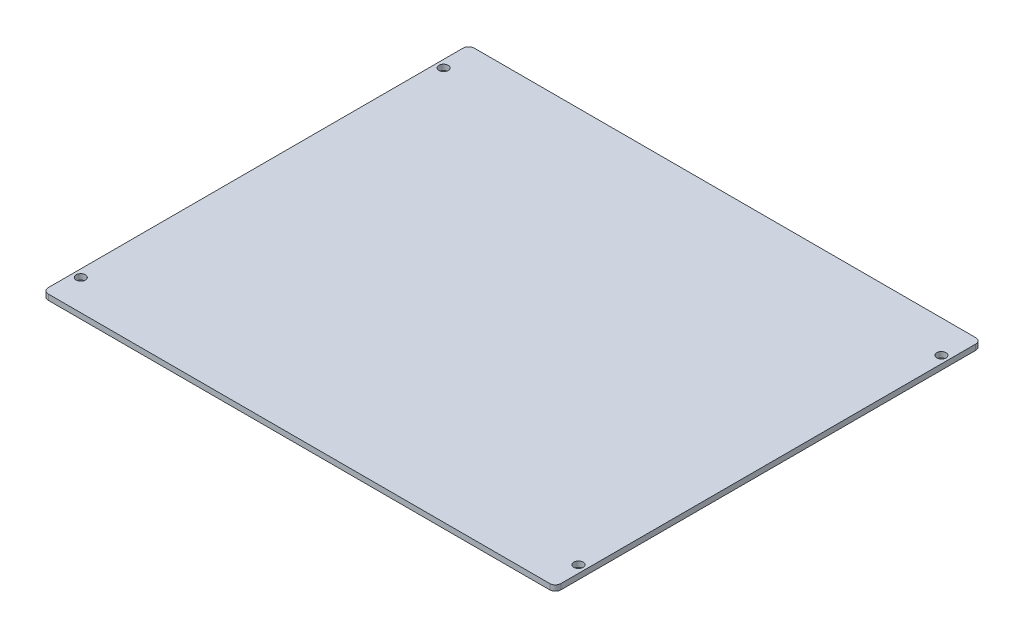
ISO-10303-21;
HEADER;
FILE_DESCRIPTION(('STEP AP214'),'2;1');
FILE_NAME('part.step','',(''),(''),'','','');
FILE_SCHEMA(('AUTOMOTIVE_DESIGN { 1 0 10303 214 1 1 1 1 }'));
ENDSEC;
DATA;
#1=APPLICATION_CONTEXT('core data for automotive mechanical design processes');
#2=APPLICATION_PROTOCOL_DEFINITION('international standard','automotive_design',2000,#1);
#3=PRODUCT_CONTEXT('',#1,'mechanical');
#4=PRODUCT('Part','Part','',(#3));
#5=PRODUCT_RELATED_PRODUCT_CATEGORY('part','',(#4));
#6=PRODUCT_DEFINITION_FORMATION('','',#4);
#7=PRODUCT_DEFINITION_CONTEXT('part definition',#1,'design');
#8=PRODUCT_DEFINITION('design','',#6,#7);
#9=PRODUCT_DEFINITION_SHAPE('','',#8);
#10=(LENGTH_UNIT() NAMED_UNIT(*) SI_UNIT(.MILLI.,.METRE.));
#11=(NAMED_UNIT(*) PLANE_ANGLE_UNIT() SI_UNIT($,.RADIAN.));
#12=(NAMED_UNIT(*) SI_UNIT($,.STERADIAN.) SOLID_ANGLE_UNIT());
#13=UNCERTAINTY_MEASURE_WITH_UNIT(LENGTH_MEASURE(1.E-05),#10,'distance_accuracy_value','');
#14=(GEOMETRIC_REPRESENTATION_CONTEXT(3) GLOBAL_UNCERTAINTY_ASSIGNED_CONTEXT((#13)) GLOBAL_UNIT_ASSIGNED_CONTEXT((#10,
#11,#12)) REPRESENTATION_CONTEXT('',''));
#15=CARTESIAN_POINT('',(0.,0.,0.));
#16=DIRECTION('',(0.,0.,1.));
#17=DIRECTION('',(1.,0.,0.));
#18=AXIS2_PLACEMENT_3D('',#15,#16,#17);
#19=CARTESIAN_POINT('',(3.,3.,-3.));
#20=DIRECTION('',(0.,-1.,0.));
#21=DIRECTION('',(0.,0.,-1.));
#22=AXIS2_PLACEMENT_3D('',#19,#20,#21);
#23=PLANE('',#22);
#24=CARTESIAN_POINT('',(3.,3.,-3.));
#25=DIRECTION('',(0.,1.,0.));
#26=DIRECTION('',(0.,0.,-1.));
#27=AXIS2_PLACEMENT_3D('',#24,#25,#26);
#28=CIRCLE('',#27,3.);
#29=CARTESIAN_POINT('',(0.,3.,-3.));
#30=VERTEX_POINT('',#29);
#31=CARTESIAN_POINT('',(3.,3.,0.));
#32=VERTEX_POINT('',#31);
#33=EDGE_CURVE('E170',#30,#32,#28,.T.);
#34=ORIENTED_EDGE('',*,*,#33,.T.);
#35=DIRECTION('',(1.,0.,0.));
#36=VECTOR('',#35,1.);
#37=CARTESIAN_POINT('',(3.,3.,0.));
#38=LINE('',#37,#36);
#39=CARTESIAN_POINT('',(275.,3.,0.));
#40=VERTEX_POINT('',#39);
#41=EDGE_CURVE('E106',#32,#40,#38,.T.);
#42=ORIENTED_EDGE('',*,*,#41,.T.);
#43=CARTESIAN_POINT('',(275.,3.,-3.));
#44=DIRECTION('',(0.,1.,0.));
#45=DIRECTION('',(0.,0.,1.));
#46=AXIS2_PLACEMENT_3D('',#43,#44,#45);
#47=CIRCLE('',#46,3.);
#48=CARTESIAN_POINT('',(278.,3.,-3.));
#49=VERTEX_POINT('',#48);
#50=EDGE_CURVE('E191',#40,#49,#47,.T.);
#51=ORIENTED_EDGE('',*,*,#50,.T.);
#52=DIRECTION('',(0.,0.,-1.));
#53=VECTOR('',#52,1.);
#54=CARTESIAN_POINT('',(278.,3.,-3.));
#55=LINE('',#54,#53);
#56=CARTESIAN_POINT('',(278.,3.,-228.));
#57=VERTEX_POINT('',#56);
#58=EDGE_CURVE('E205',#49,#57,#55,.T.);
#59=ORIENTED_EDGE('',*,*,#58,.T.);
#60=CARTESIAN_POINT('',(275.,3.,-228.));
#61=DIRECTION('',(0.,1.,0.));
#62=DIRECTION('',(0.,0.,-1.));
#63=AXIS2_PLACEMENT_3D('',#60,#61,#62);
#64=CIRCLE('',#63,3.);
#65=CARTESIAN_POINT('',(275.,3.,-231.));
#66=VERTEX_POINT('',#65);
#67=EDGE_CURVE('E125',#57,#66,#64,.T.);
#68=ORIENTED_EDGE('',*,*,#67,.T.);
#69=DIRECTION('',(-1.,0.,0.));
#70=VECTOR('',#69,1.);
#71=CARTESIAN_POINT('',(3.,3.,-231.));
#72=LINE('',#71,#70);
#73=CARTESIAN_POINT('',(3.,3.,-231.));
#74=VERTEX_POINT('',#73);
#75=EDGE_CURVE('E119',#66,#74,#72,.T.);
#76=ORIENTED_EDGE('',*,*,#75,.T.);
#77=CARTESIAN_POINT('',(3.,3.,-228.));
#78=DIRECTION('',(0.,1.,0.));
#79=DIRECTION('',(0.,0.,-1.));
#80=AXIS2_PLACEMENT_3D('',#77,#78,#79);
#81=CIRCLE('',#80,3.);
#82=CARTESIAN_POINT('',(0.,3.,-228.));
#83=VERTEX_POINT('',#82);
#84=EDGE_CURVE('E123',#74,#83,#81,.T.);
#85=ORIENTED_EDGE('',*,*,#84,.T.);
#86=DIRECTION('',(0.,0.,1.));
#87=VECTOR('',#86,1.);
#88=CARTESIAN_POINT('',(0.,3.,-3.));
#89=LINE('',#88,#87);
#90=EDGE_CURVE('E63',#83,#30,#89,.T.);
#91=ORIENTED_EDGE('',*,*,#90,.T.);
#92=EDGE_LOOP('',(#34,#42,#51,#59,#68,#76,#85,#91));
#93=FACE_BOUND('',#92,.T.);
#94=CARTESIAN_POINT('',(4.03226132280665,3.,-213.395));
#95=DIRECTION('',(0.,1.,0.));
#96=DIRECTION('',(0.,0.,1.));
#97=AXIS2_PLACEMENT_3D('',#94,#95,#96);
#98=CIRCLE('',#97,2.5);
#99=CARTESIAN_POINT('',(4.03226132280665,3.,-210.895));
#100=VERTEX_POINT('',#99);
#101=EDGE_CURVE('E152',#100,#100,#98,.T.);
#102=ORIENTED_EDGE('',*,*,#101,.F.);
#103=EDGE_LOOP('',(#102));
#104=FACE_BOUND('',#103,.T.);
#105=CARTESIAN_POINT('',(4.03226132280665,3.,-16.605));
#106=DIRECTION('',(0.,1.,0.));
#107=DIRECTION('',(0.,0.,-1.));
#108=AXIS2_PLACEMENT_3D('',#105,#106,#107);
#109=CIRCLE('',#108,2.5);
#110=CARTESIAN_POINT('',(4.03226132280665,3.,-19.105));
#111=VERTEX_POINT('',#110);
#112=EDGE_CURVE('E219',#111,#111,#109,.T.);
#113=ORIENTED_EDGE('',*,*,#112,.F.);
#114=EDGE_LOOP('',(#113));
#115=FACE_BOUND('',#114,.T.);
#116=CARTESIAN_POINT('',(273.967738677193,3.,-16.605));
#117=DIRECTION('',(0.,1.,0.));
#118=DIRECTION('',(0.,0.,1.));
#119=AXIS2_PLACEMENT_3D('',#116,#117,#118);
#120=CIRCLE('',#119,2.50000000000002);
#121=CARTESIAN_POINT('',(273.967738677193,3.,-14.105));
#122=VERTEX_POINT('',#121);
#123=EDGE_CURVE('E227',#122,#122,#120,.T.);
#124=ORIENTED_EDGE('',*,*,#123,.F.);
#125=EDGE_LOOP('',(#124));
#126=FACE_BOUND('',#125,.T.);
#127=CARTESIAN_POINT('',(273.967738677193,3.,-213.395));
#128=DIRECTION('',(0.,1.,0.));
#129=DIRECTION('',(0.,0.,-1.));
#130=AXIS2_PLACEMENT_3D('',#127,#128,#129);
#131=CIRCLE('',#130,2.50000000000002);
#132=CARTESIAN_POINT('',(273.967738677193,3.,-215.895));
#133=VERTEX_POINT('',#132);
#134=EDGE_CURVE('E235',#133,#133,#131,.T.);
#135=ORIENTED_EDGE('',*,*,#134,.F.);
#136=EDGE_LOOP('',(#135));
#137=FACE_BOUND('',#136,.T.);
#138=ADVANCED_FACE('F45',(#93,#104,#115,#126,#137),#23,.F.);
#139=CARTESIAN_POINT('',(3.,0.,-3.));
#140=DIRECTION('',(0.,-1.,0.));
#141=DIRECTION('',(0.,0.,-1.));
#142=AXIS2_PLACEMENT_3D('',#139,#140,#141);
#143=PLANE('',#142);
#144=CARTESIAN_POINT('',(273.967738677193,0.,-16.605));
#145=DIRECTION('',(0.,1.,0.));
#146=DIRECTION('',(0.,0.,1.));
#147=AXIS2_PLACEMENT_3D('',#144,#145,#146);
#148=CIRCLE('',#147,2.50000000000002);
#149=CARTESIAN_POINT('',(273.967738677193,0.,-14.105));
#150=VERTEX_POINT('',#149);
#151=EDGE_CURVE('E231',#150,#150,#148,.T.);
#152=ORIENTED_EDGE('',*,*,#151,.T.);
#153=EDGE_LOOP('',(#152));
#154=FACE_BOUND('',#153,.T.);
#155=CARTESIAN_POINT('',(4.03226132280665,0.,-213.395));
#156=DIRECTION('',(0.,1.,0.));
#157=DIRECTION('',(0.,0.,1.));
#158=AXIS2_PLACEMENT_3D('',#155,#156,#157);
#159=CIRCLE('',#158,2.5);
#160=CARTESIAN_POINT('',(4.03226132280665,0.,-210.895));
#161=VERTEX_POINT('',#160);
#162=EDGE_CURVE('E215',#161,#161,#159,.T.);
#163=ORIENTED_EDGE('',*,*,#162,.T.);
#164=EDGE_LOOP('',(#163));
#165=FACE_BOUND('',#164,.T.);
#166=CARTESIAN_POINT('',(3.,0.,-3.));
#167=DIRECTION('',(0.,1.,0.));
#168=DIRECTION('',(0.,0.,-1.));
#169=AXIS2_PLACEMENT_3D('',#166,#167,#168);
#170=CIRCLE('',#169,3.);
#171=CARTESIAN_POINT('',(0.,0.,-3.));
#172=VERTEX_POINT('',#171);
#173=CARTESIAN_POINT('',(3.,0.,0.));
#174=VERTEX_POINT('',#173);
#175=EDGE_CURVE('E147',#172,#174,#170,.T.);
#176=ORIENTED_EDGE('',*,*,#175,.F.);
#177=DIRECTION('',(0.,0.,1.));
#178=VECTOR('',#177,1.);
#179=CARTESIAN_POINT('',(0.,0.,-3.));
#180=LINE('',#179,#178);
#181=CARTESIAN_POINT('',(0.,0.,-228.));
#182=VERTEX_POINT('',#181);
#183=EDGE_CURVE('E98',#182,#172,#180,.T.);
#184=ORIENTED_EDGE('',*,*,#183,.F.);
#185=CARTESIAN_POINT('',(3.,0.,-228.));
#186=DIRECTION('',(0.,1.,0.));
#187=DIRECTION('',(0.,0.,-1.));
#188=AXIS2_PLACEMENT_3D('',#185,#186,#187);
#189=CIRCLE('',#188,3.);
#190=CARTESIAN_POINT('',(3.,0.,-231.));
#191=VERTEX_POINT('',#190);
#192=EDGE_CURVE('E92',#191,#182,#189,.T.);
#193=ORIENTED_EDGE('',*,*,#192,.F.);
#194=DIRECTION('',(-1.,0.,0.));
#195=VECTOR('',#194,1.);
#196=CARTESIAN_POINT('',(3.,0.,-231.));
#197=LINE('',#196,#195);
#198=CARTESIAN_POINT('',(275.,0.,-231.));
#199=VERTEX_POINT('',#198);
#200=EDGE_CURVE('E134',#199,#191,#197,.T.);
#201=ORIENTED_EDGE('',*,*,#200,.F.);
#202=CARTESIAN_POINT('',(275.,0.,-228.));
#203=DIRECTION('',(0.,1.,0.));
#204=DIRECTION('',(0.,0.,-1.));
#205=AXIS2_PLACEMENT_3D('',#202,#203,#204);
#206=CIRCLE('',#205,3.);
#207=CARTESIAN_POINT('',(278.,0.,-228.));
#208=VERTEX_POINT('',#207);
#209=EDGE_CURVE('E161',#208,#199,#206,.T.);
#210=ORIENTED_EDGE('',*,*,#209,.F.);
#211=DIRECTION('',(0.,0.,-1.));
#212=VECTOR('',#211,1.);
#213=CARTESIAN_POINT('',(278.,0.,-3.));
#214=LINE('',#213,#212);
#215=CARTESIAN_POINT('',(278.,0.,-3.));
#216=VERTEX_POINT('',#215);
#217=EDGE_CURVE('E158',#216,#208,#214,.T.);
#218=ORIENTED_EDGE('',*,*,#217,.F.);
#219=CARTESIAN_POINT('',(275.,0.,-3.));
#220=DIRECTION('',(0.,1.,0.));
#221=DIRECTION('',(0.,0.,1.));
#222=AXIS2_PLACEMENT_3D('',#219,#220,#221);
#223=CIRCLE('',#222,3.);
#224=CARTESIAN_POINT('',(275.,0.,0.));
#225=VERTEX_POINT('',#224);
#226=EDGE_CURVE('E155',#225,#216,#223,.T.);
#227=ORIENTED_EDGE('',*,*,#226,.F.);
#228=DIRECTION('',(1.,0.,0.));
#229=VECTOR('',#228,1.);
#230=CARTESIAN_POINT('',(3.,0.,0.));
#231=LINE('',#230,#229);
#232=EDGE_CURVE('E151',#174,#225,#231,.T.);
#233=ORIENTED_EDGE('',*,*,#232,.F.);
#234=EDGE_LOOP('',(#176,#184,#193,#201,#210,#218,#227,#233));
#235=FACE_BOUND('',#234,.T.);
#236=CARTESIAN_POINT('',(4.03226132280665,0.,-16.605));
#237=DIRECTION('',(0.,1.,0.));
#238=DIRECTION('',(0.,0.,-1.));
#239=AXIS2_PLACEMENT_3D('',#236,#237,#238);
#240=CIRCLE('',#239,2.5);
#241=CARTESIAN_POINT('',(4.03226132280665,0.,-19.105));
#242=VERTEX_POINT('',#241);
#243=EDGE_CURVE('E223',#242,#242,#240,.T.);
#244=ORIENTED_EDGE('',*,*,#243,.T.);
#245=EDGE_LOOP('',(#244));
#246=FACE_BOUND('',#245,.T.);
#247=CARTESIAN_POINT('',(273.967738677193,0.,-213.395));
#248=DIRECTION('',(0.,1.,0.));
#249=DIRECTION('',(0.,0.,-1.));
#250=AXIS2_PLACEMENT_3D('',#247,#248,#249);
#251=CIRCLE('',#250,2.50000000000002);
#252=CARTESIAN_POINT('',(273.967738677193,0.,-215.895));
#253=VERTEX_POINT('',#252);
#254=EDGE_CURVE('E239',#253,#253,#251,.T.);
#255=ORIENTED_EDGE('',*,*,#254,.T.);
#256=EDGE_LOOP('',(#255));
#257=FACE_BOUND('',#256,.T.);
#258=ADVANCED_FACE('F195',(#154,#165,#235,#246,#257),#143,.T.);
#259=CARTESIAN_POINT('',(3.,3.,-3.));
#260=DIRECTION('',(0.,-1.,0.));
#261=DIRECTION('',(0.,0.,-1.));
#262=AXIS2_PLACEMENT_3D('',#259,#260,#261);
#263=CYLINDRICAL_SURFACE('',#262,3.);
#264=ORIENTED_EDGE('',*,*,#175,.T.);
#265=DIRECTION('',(0.,-1.,0.));
#266=VECTOR('',#265,1.);
#267=CARTESIAN_POINT('',(3.,3.,0.));
#268=LINE('',#267,#266);
#269=EDGE_CURVE('E11',#32,#174,#268,.T.);
#270=ORIENTED_EDGE('',*,*,#269,.F.);
#271=ORIENTED_EDGE('',*,*,#33,.F.);
#272=DIRECTION('',(0.,-1.,0.));
#273=VECTOR('',#272,1.);
#274=CARTESIAN_POINT('',(0.,3.,-3.));
#275=LINE('',#274,#273);
#276=EDGE_CURVE('E143',#30,#172,#275,.T.);
#277=ORIENTED_EDGE('',*,*,#276,.T.);
#278=EDGE_LOOP('',(#264,#270,#271,#277));
#279=FACE_BOUND('',#278,.T.);
#280=ADVANCED_FACE('F47',(#279),#263,.T.);
#281=CARTESIAN_POINT('',(3.,3.,0.));
#282=DIRECTION('',(0.,0.,-1.));
#283=DIRECTION('',(-1.,0.,0.));
#284=AXIS2_PLACEMENT_3D('',#281,#282,#283);
#285=PLANE('',#284);
#286=ORIENTED_EDGE('',*,*,#232,.T.);
#287=DIRECTION('',(0.,-1.,0.));
#288=VECTOR('',#287,1.);
#289=CARTESIAN_POINT('',(275.,3.,0.));
#290=LINE('',#289,#288);
#291=EDGE_CURVE('E55',#40,#225,#290,.T.);
#292=ORIENTED_EDGE('',*,*,#291,.F.);
#293=ORIENTED_EDGE('',*,*,#41,.F.);
#294=ORIENTED_EDGE('',*,*,#269,.T.);
#295=EDGE_LOOP('',(#286,#292,#293,#294));
#296=FACE_BOUND('',#295,.T.);
#297=ADVANCED_FACE('F273',(#296),#285,.F.);
#298=CARTESIAN_POINT('',(275.,3.,-3.));
#299=DIRECTION('',(0.,-1.,0.));
#300=DIRECTION('',(0.,0.,-1.));
#301=AXIS2_PLACEMENT_3D('',#298,#299,#300);
#302=CYLINDRICAL_SURFACE('',#301,3.);
#303=ORIENTED_EDGE('',*,*,#226,.T.);
#304=DIRECTION('',(0.,-1.,0.));
#305=VECTOR('',#304,1.);
#306=CARTESIAN_POINT('',(278.,3.,-3.));
#307=LINE('',#306,#305);
#308=EDGE_CURVE('E181',#49,#216,#307,.T.);
#309=ORIENTED_EDGE('',*,*,#308,.F.);
#310=ORIENTED_EDGE('',*,*,#50,.F.);
#311=ORIENTED_EDGE('',*,*,#291,.T.);
#312=EDGE_LOOP('',(#303,#309,#310,#311));
#313=FACE_BOUND('',#312,.T.);
#314=ADVANCED_FACE('F189',(#313),#302,.T.);
#315=CARTESIAN_POINT('',(278.,3.,-3.));
#316=DIRECTION('',(-1.,0.,0.));
#317=DIRECTION('',(0.,0.,1.));
#318=AXIS2_PLACEMENT_3D('',#315,#316,#317);
#319=PLANE('',#318);
#320=ORIENTED_EDGE('',*,*,#217,.T.);
#321=DIRECTION('',(0.,-1.,0.));
#322=VECTOR('',#321,1.);
#323=CARTESIAN_POINT('',(278.,3.,-228.));
#324=LINE('',#323,#322);
#325=EDGE_CURVE('E177',#57,#208,#324,.T.);
#326=ORIENTED_EDGE('',*,*,#325,.F.);
#327=ORIENTED_EDGE('',*,*,#58,.F.);
#328=ORIENTED_EDGE('',*,*,#308,.T.);
#329=EDGE_LOOP('',(#320,#326,#327,#328));
#330=FACE_BOUND('',#329,.T.);
#331=ADVANCED_FACE('F200',(#330),#319,.F.);
#332=CARTESIAN_POINT('',(275.,3.,-228.));
#333=DIRECTION('',(0.,-1.,0.));
#334=DIRECTION('',(0.,0.,-1.));
#335=AXIS2_PLACEMENT_3D('',#332,#333,#334);
#336=CYLINDRICAL_SURFACE('',#335,3.);
#337=ORIENTED_EDGE('',*,*,#209,.T.);
#338=DIRECTION('',(0.,-1.,0.));
#339=VECTOR('',#338,1.);
#340=CARTESIAN_POINT('',(275.,3.,-231.));
#341=LINE('',#340,#339);
#342=EDGE_CURVE('E136',#66,#199,#341,.T.);
#343=ORIENTED_EDGE('',*,*,#342,.F.);
#344=ORIENTED_EDGE('',*,*,#67,.F.);
#345=ORIENTED_EDGE('',*,*,#325,.T.);
#346=EDGE_LOOP('',(#337,#343,#344,#345));
#347=FACE_BOUND('',#346,.T.);
#348=ADVANCED_FACE('F203',(#347),#336,.T.);
#349=CARTESIAN_POINT('',(3.,3.,-231.));
#350=DIRECTION('',(0.,0.,1.));
#351=DIRECTION('',(1.,0.,0.));
#352=AXIS2_PLACEMENT_3D('',#349,#350,#351);
#353=PLANE('',#352);
#354=ORIENTED_EDGE('',*,*,#200,.T.);
#355=DIRECTION('',(0.,-1.,0.));
#356=VECTOR('',#355,1.);
#357=CARTESIAN_POINT('',(3.,3.,-231.));
#358=LINE('',#357,#356);
#359=EDGE_CURVE('E131',#74,#191,#358,.T.);
#360=ORIENTED_EDGE('',*,*,#359,.F.);
#361=ORIENTED_EDGE('',*,*,#75,.F.);
#362=ORIENTED_EDGE('',*,*,#342,.T.);
#363=EDGE_LOOP('',(#354,#360,#361,#362));
#364=FACE_BOUND('',#363,.T.);
#365=ADVANCED_FACE('F132',(#364),#353,.F.);
#366=CARTESIAN_POINT('',(3.,3.,-228.));
#367=DIRECTION('',(0.,-1.,0.));
#368=DIRECTION('',(0.,0.,-1.));
#369=AXIS2_PLACEMENT_3D('',#366,#367,#368);
#370=CYLINDRICAL_SURFACE('',#369,3.);
#371=ORIENTED_EDGE('',*,*,#192,.T.);
#372=DIRECTION('',(0.,-1.,0.));
#373=VECTOR('',#372,1.);
#374=CARTESIAN_POINT('',(0.,3.,-228.));
#375=LINE('',#374,#373);
#376=EDGE_CURVE('E137',#83,#182,#375,.T.);
#377=ORIENTED_EDGE('',*,*,#376,.F.);
#378=ORIENTED_EDGE('',*,*,#84,.F.);
#379=ORIENTED_EDGE('',*,*,#359,.T.);
#380=EDGE_LOOP('',(#371,#377,#378,#379));
#381=FACE_BOUND('',#380,.T.);
#382=ADVANCED_FACE('F139',(#381),#370,.T.);
#383=CARTESIAN_POINT('',(0.,3.,-3.));
#384=DIRECTION('',(1.,0.,0.));
#385=DIRECTION('',(0.,0.,-1.));
#386=AXIS2_PLACEMENT_3D('',#383,#384,#385);
#387=PLANE('',#386);
#388=ORIENTED_EDGE('',*,*,#183,.T.);
#389=ORIENTED_EDGE('',*,*,#276,.F.);
#390=ORIENTED_EDGE('',*,*,#90,.F.);
#391=ORIENTED_EDGE('',*,*,#376,.T.);
#392=EDGE_LOOP('',(#388,#389,#390,#391));
#393=FACE_BOUND('',#392,.T.);
#394=ADVANCED_FACE('F261',(#393),#387,.F.);
#395=CARTESIAN_POINT('',(4.03226132280665,3.,-213.395));
#396=DIRECTION('',(0.,-1.,0.));
#397=DIRECTION('',(0.,0.,-1.));
#398=AXIS2_PLACEMENT_3D('',#395,#396,#397);
#399=CYLINDRICAL_SURFACE('',#398,2.5);
#400=ORIENTED_EDGE('',*,*,#101,.T.);
#401=EDGE_LOOP('',(#400));
#402=FACE_BOUND('',#401,.T.);
#403=ORIENTED_EDGE('',*,*,#162,.F.);
#404=EDGE_LOOP('',(#403));
#405=FACE_BOUND('',#404,.T.);
#406=ADVANCED_FACE('F258',(#402,#405),#399,.F.);
#407=CARTESIAN_POINT('',(4.03226132280665,3.,-16.605));
#408=DIRECTION('',(0.,-1.,0.));
#409=DIRECTION('',(0.,0.,-1.));
#410=AXIS2_PLACEMENT_3D('',#407,#408,#409);
#411=CYLINDRICAL_SURFACE('',#410,2.5);
#412=ORIENTED_EDGE('',*,*,#112,.T.);
#413=EDGE_LOOP('',(#412));
#414=FACE_BOUND('',#413,.T.);
#415=ORIENTED_EDGE('',*,*,#243,.F.);
#416=EDGE_LOOP('',(#415));
#417=FACE_BOUND('',#416,.T.);
#418=ADVANCED_FACE('F336',(#414,#417),#411,.F.);
#419=CARTESIAN_POINT('',(273.967738677193,3.,-16.605));
#420=DIRECTION('',(0.,-1.,0.));
#421=DIRECTION('',(0.,0.,-1.));
#422=AXIS2_PLACEMENT_3D('',#419,#420,#421);
#423=CYLINDRICAL_SURFACE('',#422,2.50000000000002);
#424=ORIENTED_EDGE('',*,*,#123,.T.);
#425=EDGE_LOOP('',(#424));
#426=FACE_BOUND('',#425,.T.);
#427=ORIENTED_EDGE('',*,*,#151,.F.);
#428=EDGE_LOOP('',(#427));
#429=FACE_BOUND('',#428,.T.);
#430=ADVANCED_FACE('F344',(#426,#429),#423,.F.);
#431=CARTESIAN_POINT('',(273.967738677193,3.,-213.395));
#432=DIRECTION('',(0.,-1.,0.));
#433=DIRECTION('',(0.,0.,-1.));
#434=AXIS2_PLACEMENT_3D('',#431,#432,#433);
#435=CYLINDRICAL_SURFACE('',#434,2.50000000000002);
#436=ORIENTED_EDGE('',*,*,#134,.T.);
#437=EDGE_LOOP('',(#436));
#438=FACE_BOUND('',#437,.T.);
#439=ORIENTED_EDGE('',*,*,#254,.F.);
#440=EDGE_LOOP('',(#439));
#441=FACE_BOUND('',#440,.T.);
#442=ADVANCED_FACE('F247',(#438,#441),#435,.F.);
#443=CLOSED_SHELL('',(#138,#258,#280,#297,#314,#331,#348,#365,#382,#394,#406,#418,#430,#442));
#444=MANIFOLD_SOLID_BREP('B2',#443);
#445=ADVANCED_BREP_SHAPE_REPRESENTATION('',(#18,#444),#14);
#446=SHAPE_DEFINITION_REPRESENTATION(#9,#445);
ENDSEC;
END-ISO-10303-21;
